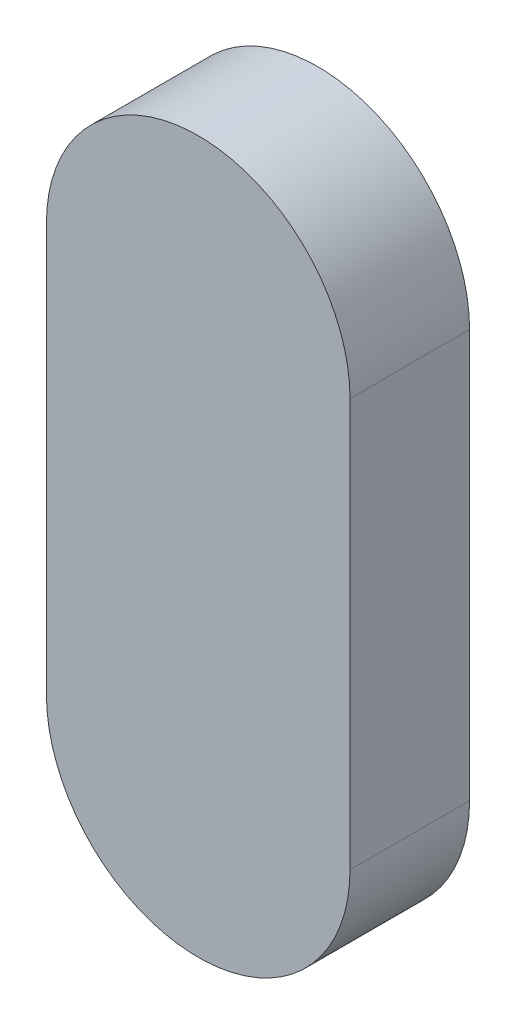
ISO-10303-21;
HEADER;
FILE_DESCRIPTION(('STEP AP214'),'2;1');
FILE_NAME('part.step','',(''),(''),'','','');
FILE_SCHEMA(('AUTOMOTIVE_DESIGN { 1 0 10303 214 1 1 1 1 }'));
ENDSEC;
DATA;
#1=APPLICATION_CONTEXT('core data for automotive mechanical design processes');
#2=APPLICATION_PROTOCOL_DEFINITION('international standard','automotive_design',2000,#1);
#3=PRODUCT_CONTEXT('',#1,'mechanical');
#4=PRODUCT('Part','Part','',(#3));
#5=PRODUCT_RELATED_PRODUCT_CATEGORY('part','',(#4));
#6=PRODUCT_DEFINITION_FORMATION('','',#4);
#7=PRODUCT_DEFINITION_CONTEXT('part definition',#1,'design');
#8=PRODUCT_DEFINITION('design','',#6,#7);
#9=PRODUCT_DEFINITION_SHAPE('','',#8);
#10=(LENGTH_UNIT() NAMED_UNIT(*) SI_UNIT(.MILLI.,.METRE.));
#11=(NAMED_UNIT(*) PLANE_ANGLE_UNIT() SI_UNIT($,.RADIAN.));
#12=(NAMED_UNIT(*) SI_UNIT($,.STERADIAN.) SOLID_ANGLE_UNIT());
#13=UNCERTAINTY_MEASURE_WITH_UNIT(LENGTH_MEASURE(1.E-05),#10,'distance_accuracy_value','');
#14=(GEOMETRIC_REPRESENTATION_CONTEXT(3) GLOBAL_UNCERTAINTY_ASSIGNED_CONTEXT((#13)) GLOBAL_UNIT_ASSIGNED_CONTEXT((#10,
#11,#12)) REPRESENTATION_CONTEXT('',''));
#15=CARTESIAN_POINT('',(0.,0.,0.));
#16=DIRECTION('',(0.,0.,1.));
#17=DIRECTION('',(1.,0.,0.));
#18=AXIS2_PLACEMENT_3D('',#15,#16,#17);
#19=CARTESIAN_POINT('',(150.368,76.4032,0.));
#20=DIRECTION('',(-1.,0.,0.));
#21=DIRECTION('',(0.,1.,0.));
#22=AXIS2_PLACEMENT_3D('',#19,#20,#21);
#23=PLANE('',#22);
#24=DIRECTION('',(0.,1.,0.));
#25=VECTOR('',#24,1.);
#26=CARTESIAN_POINT('',(150.368,76.4032,0.1999996));
#27=LINE('',#26,#25);
#28=CARTESIAN_POINT('',(150.368,76.4032,0.1999996));
#29=VERTEX_POINT('',#28);
#30=CARTESIAN_POINT('',(150.368,77.0860028,0.1999996));
#31=VERTEX_POINT('',#30);
#32=EDGE_CURVE('E11',#29,#31,#27,.T.);
#33=ORIENTED_EDGE('',*,*,#32,.F.);
#34=DIRECTION('',(0.,0.,1.));
#35=VECTOR('',#34,1.);
#36=CARTESIAN_POINT('',(150.368,76.4032,0.));
#37=LINE('',#36,#35);
#38=CARTESIAN_POINT('',(150.368,76.4032,0.));
#39=VERTEX_POINT('',#38);
#40=EDGE_CURVE('E24',#39,#29,#37,.T.);
#41=ORIENTED_EDGE('',*,*,#40,.F.);
#42=DIRECTION('',(0.,1.,0.));
#43=VECTOR('',#42,1.);
#44=CARTESIAN_POINT('',(150.368,76.4032,0.));
#45=LINE('',#44,#43);
#46=CARTESIAN_POINT('',(150.368,77.0860028,0.));
#47=VERTEX_POINT('',#46);
#48=EDGE_CURVE('E75',#39,#47,#45,.T.);
#49=ORIENTED_EDGE('',*,*,#48,.T.);
#50=DIRECTION('',(0.,0.,1.));
#51=VECTOR('',#50,1.);
#52=CARTESIAN_POINT('',(150.368,77.0860028,0.));
#53=LINE('',#52,#51);
#54=EDGE_CURVE('E37',#47,#31,#53,.T.);
#55=ORIENTED_EDGE('',*,*,#54,.T.);
#56=EDGE_LOOP('',(#33,#41,#49,#55));
#57=FACE_BOUND('',#56,.T.);
#58=ADVANCED_FACE('F17',(#57),#23,.F.);
#59=CARTESIAN_POINT('',(150.114,77.0860028,0.));
#60=DIRECTION('',(0.,0.,-1.));
#61=DIRECTION('',(1.,-1.11896493820492E-13,0.));
#62=AXIS2_PLACEMENT_3D('',#59,#60,#61);
#63=CYLINDRICAL_SURFACE('',#62,0.253999999999986);
#64=CARTESIAN_POINT('',(150.114,77.0860028,0.1999996));
#65=DIRECTION('',(0.,0.,1.));
#66=DIRECTION('',(1.,-1.11896493820492E-13,0.));
#67=AXIS2_PLACEMENT_3D('',#64,#65,#66);
#68=CIRCLE('',#67,0.253999999999986);
#69=CARTESIAN_POINT('',(149.86,77.0860028,0.1999996));
#70=VERTEX_POINT('',#69);
#71=EDGE_CURVE('E83',#31,#70,#68,.T.);
#72=ORIENTED_EDGE('',*,*,#71,.F.);
#73=ORIENTED_EDGE('',*,*,#54,.F.);
#74=CARTESIAN_POINT('',(150.114,77.0860028,0.));
#75=DIRECTION('',(0.,0.,1.));
#76=DIRECTION('',(1.,-1.11896493820492E-13,0.));
#77=AXIS2_PLACEMENT_3D('',#74,#75,#76);
#78=CIRCLE('',#77,0.253999999999986);
#79=CARTESIAN_POINT('',(149.86,77.0860028,0.));
#80=VERTEX_POINT('',#79);
#81=EDGE_CURVE('E81',#47,#80,#78,.T.);
#82=ORIENTED_EDGE('',*,*,#81,.T.);
#83=DIRECTION('',(0.,0.,1.));
#84=VECTOR('',#83,1.);
#85=CARTESIAN_POINT('',(149.86,77.0860028,0.));
#86=LINE('',#85,#84);
#87=EDGE_CURVE('E67',#80,#70,#86,.T.);
#88=ORIENTED_EDGE('',*,*,#87,.T.);
#89=EDGE_LOOP('',(#72,#73,#82,#88));
#90=FACE_BOUND('',#89,.T.);
#91=ADVANCED_FACE('F89',(#90),#63,.T.);
#92=CARTESIAN_POINT('',(149.86,77.0860028,0.));
#93=DIRECTION('',(1.,0.,0.));
#94=DIRECTION('',(0.,-1.,0.));
#95=AXIS2_PLACEMENT_3D('',#92,#93,#94);
#96=PLANE('',#95);
#97=DIRECTION('',(0.,-1.,0.));
#98=VECTOR('',#97,1.);
#99=CARTESIAN_POINT('',(149.86,77.0860028,0.1999996));
#100=LINE('',#99,#98);
#101=CARTESIAN_POINT('',(149.86,76.4032,0.1999996));
#102=VERTEX_POINT('',#101);
#103=EDGE_CURVE('E71',#70,#102,#100,.T.);
#104=ORIENTED_EDGE('',*,*,#103,.F.);
#105=ORIENTED_EDGE('',*,*,#87,.F.);
#106=DIRECTION('',(0.,-1.,0.));
#107=VECTOR('',#106,1.);
#108=CARTESIAN_POINT('',(149.86,77.0860028,0.));
#109=LINE('',#108,#107);
#110=CARTESIAN_POINT('',(149.86,76.4032,0.));
#111=VERTEX_POINT('',#110);
#112=EDGE_CURVE('E63',#80,#111,#109,.T.);
#113=ORIENTED_EDGE('',*,*,#112,.T.);
#114=DIRECTION('',(0.,0.,1.));
#115=VECTOR('',#114,1.);
#116=CARTESIAN_POINT('',(149.86,76.4032,0.));
#117=LINE('',#116,#115);
#118=EDGE_CURVE('E53',#111,#102,#117,.T.);
#119=ORIENTED_EDGE('',*,*,#118,.T.);
#120=EDGE_LOOP('',(#104,#105,#113,#119));
#121=FACE_BOUND('',#120,.T.);
#122=ADVANCED_FACE('F66',(#121),#96,.F.);
#123=CARTESIAN_POINT('',(150.114,76.4032,0.));
#124=DIRECTION('',(0.,0.,-1.));
#125=DIRECTION('',(-1.,1.11896493820492E-13,0.));
#126=AXIS2_PLACEMENT_3D('',#123,#124,#125);
#127=CYLINDRICAL_SURFACE('',#126,0.253999999999986);
#128=CARTESIAN_POINT('',(150.114,76.4032,0.1999996));
#129=DIRECTION('',(0.,0.,1.));
#130=DIRECTION('',(-1.,1.11896493820492E-13,0.));
#131=AXIS2_PLACEMENT_3D('',#128,#129,#130);
#132=CIRCLE('',#131,0.253999999999986);
#133=EDGE_CURVE('E59',#102,#29,#132,.T.);
#134=ORIENTED_EDGE('',*,*,#133,.F.);
#135=ORIENTED_EDGE('',*,*,#118,.F.);
#136=CARTESIAN_POINT('',(150.114,76.4032,0.));
#137=DIRECTION('',(0.,0.,1.));
#138=DIRECTION('',(-1.,1.11896493820492E-13,0.));
#139=AXIS2_PLACEMENT_3D('',#136,#137,#138);
#140=CIRCLE('',#139,0.253999999999986);
#141=EDGE_CURVE('E57',#111,#39,#140,.T.);
#142=ORIENTED_EDGE('',*,*,#141,.T.);
#143=ORIENTED_EDGE('',*,*,#40,.T.);
#144=EDGE_LOOP('',(#134,#135,#142,#143));
#145=FACE_BOUND('',#144,.T.);
#146=ADVANCED_FACE('F55',(#145),#127,.T.);
#147=CARTESIAN_POINT('',(150.368,76.4032,0.));
#148=DIRECTION('',(0.,0.,-1.));
#149=DIRECTION('',(-1.,0.,0.));
#150=AXIS2_PLACEMENT_3D('',#147,#148,#149);
#151=PLANE('',#150);
#152=ORIENTED_EDGE('',*,*,#141,.F.);
#153=ORIENTED_EDGE('',*,*,#112,.F.);
#154=ORIENTED_EDGE('',*,*,#81,.F.);
#155=ORIENTED_EDGE('',*,*,#48,.F.);
#156=EDGE_LOOP('',(#152,#153,#154,#155));
#157=FACE_BOUND('',#156,.T.);
#158=ADVANCED_FACE('F74',(#157),#151,.T.);
#159=CARTESIAN_POINT('',(150.368,76.4032,0.1999996));
#160=DIRECTION('',(0.,0.,-1.));
#161=DIRECTION('',(-1.,0.,0.));
#162=AXIS2_PLACEMENT_3D('',#159,#160,#161);
#163=PLANE('',#162);
#164=ORIENTED_EDGE('',*,*,#32,.T.);
#165=ORIENTED_EDGE('',*,*,#71,.T.);
#166=ORIENTED_EDGE('',*,*,#103,.T.);
#167=ORIENTED_EDGE('',*,*,#133,.T.);
#168=EDGE_LOOP('',(#164,#165,#166,#167));
#169=FACE_BOUND('',#168,.T.);
#170=ADVANCED_FACE('F91',(#169),#163,.F.);
#171=CLOSED_SHELL('',(#58,#91,#122,#146,#158,#170));
#172=MANIFOLD_SOLID_BREP('B1',#171);
#173=ADVANCED_BREP_SHAPE_REPRESENTATION('',(#18,#172),#14);
#174=SHAPE_DEFINITION_REPRESENTATION(#9,#173);
ENDSEC;
END-ISO-10303-21;
